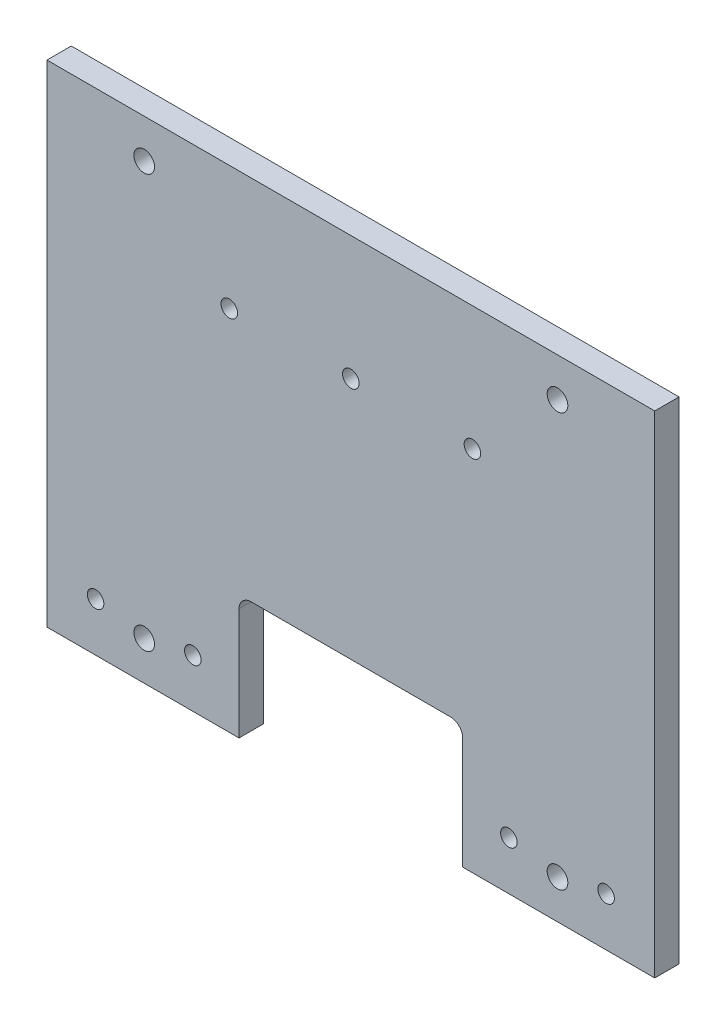
ISO-10303-21;
HEADER;
FILE_DESCRIPTION(('STEP AP214'),'2;1');
FILE_NAME('part.step','',(''),(''),'','','');
FILE_SCHEMA(('AUTOMOTIVE_DESIGN { 1 0 10303 214 1 1 1 1 }'));
ENDSEC;
DATA;
#1=APPLICATION_CONTEXT('core data for automotive mechanical design processes');
#2=APPLICATION_PROTOCOL_DEFINITION('international standard','automotive_design',2000,#1);
#3=PRODUCT_CONTEXT('',#1,'mechanical');
#4=PRODUCT('Part','Part','',(#3));
#5=PRODUCT_RELATED_PRODUCT_CATEGORY('part','',(#4));
#6=PRODUCT_DEFINITION_FORMATION('','',#4);
#7=PRODUCT_DEFINITION_CONTEXT('part definition',#1,'design');
#8=PRODUCT_DEFINITION('design','',#6,#7);
#9=PRODUCT_DEFINITION_SHAPE('','',#8);
#10=(LENGTH_UNIT() NAMED_UNIT(*) SI_UNIT(.MILLI.,.METRE.));
#11=(NAMED_UNIT(*) PLANE_ANGLE_UNIT() SI_UNIT($,.RADIAN.));
#12=(NAMED_UNIT(*) SI_UNIT($,.STERADIAN.) SOLID_ANGLE_UNIT());
#13=UNCERTAINTY_MEASURE_WITH_UNIT(LENGTH_MEASURE(1.E-05),#10,'distance_accuracy_value','');
#14=(GEOMETRIC_REPRESENTATION_CONTEXT(3) GLOBAL_UNCERTAINTY_ASSIGNED_CONTEXT((#13)) GLOBAL_UNIT_ASSIGNED_CONTEXT((#10,
#11,#12)) REPRESENTATION_CONTEXT('',''));
#15=CARTESIAN_POINT('',(0.,0.,0.));
#16=DIRECTION('',(0.,0.,1.));
#17=DIRECTION('',(1.,0.,0.));
#18=AXIS2_PLACEMENT_3D('',#15,#16,#17);
#19=CARTESIAN_POINT('',(-41.,-55.,10.));
#20=DIRECTION('',(0.,0.,-1.));
#21=DIRECTION('',(-1.,0.,0.));
#22=AXIS2_PLACEMENT_3D('',#19,#20,#21);
#23=CYLINDRICAL_SURFACE('',#22,5.);
#24=CARTESIAN_POINT('',(-41.,-55.,0.));
#25=DIRECTION('',(0.,0.,1.));
#26=DIRECTION('',(1.,0.,0.));
#27=AXIS2_PLACEMENT_3D('',#24,#25,#26);
#28=CIRCLE('',#27,5.);
#29=CARTESIAN_POINT('',(-41.,-50.,0.));
#30=VERTEX_POINT('',#29);
#31=CARTESIAN_POINT('',(-46.,-55.,0.));
#32=VERTEX_POINT('',#31);
#33=EDGE_CURVE('E165',#30,#32,#28,.T.);
#34=ORIENTED_EDGE('',*,*,#33,.F.);
#35=DIRECTION('',(0.,0.,-1.));
#36=VECTOR('',#35,1.);
#37=CARTESIAN_POINT('',(-41.,-50.,10.));
#38=LINE('',#37,#36);
#39=CARTESIAN_POINT('',(-41.,-50.,10.));
#40=VERTEX_POINT('',#39);
#41=EDGE_CURVE('E11',#40,#30,#38,.T.);
#42=ORIENTED_EDGE('',*,*,#41,.F.);
#43=CARTESIAN_POINT('',(-41.,-55.,10.));
#44=DIRECTION('',(0.,0.,1.));
#45=DIRECTION('',(1.,0.,0.));
#46=AXIS2_PLACEMENT_3D('',#43,#44,#45);
#47=CIRCLE('',#46,5.);
#48=CARTESIAN_POINT('',(-46.,-55.,10.));
#49=VERTEX_POINT('',#48);
#50=EDGE_CURVE('E159',#40,#49,#47,.T.);
#51=ORIENTED_EDGE('',*,*,#50,.T.);
#52=DIRECTION('',(0.,0.,-1.));
#53=VECTOR('',#52,1.);
#54=CARTESIAN_POINT('',(-46.,-55.,10.));
#55=LINE('',#54,#53);
#56=EDGE_CURVE('E54',#49,#32,#55,.T.);
#57=ORIENTED_EDGE('',*,*,#56,.T.);
#58=EDGE_LOOP('',(#34,#42,#51,#57));
#59=FACE_BOUND('',#58,.T.);
#60=ADVANCED_FACE('F38',(#59),#23,.F.);
#61=CARTESIAN_POINT('',(0.,-50.,10.));
#62=DIRECTION('',(0.,-1.,0.));
#63=DIRECTION('',(1.,0.,0.));
#64=AXIS2_PLACEMENT_3D('',#61,#62,#63);
#65=PLANE('',#64);
#66=DIRECTION('',(-1.,0.,0.));
#67=VECTOR('',#66,1.);
#68=CARTESIAN_POINT('',(0.,-50.,0.));
#69=LINE('',#68,#67);
#70=CARTESIAN_POINT('',(40.9999999999999,-50.,0.));
#71=VERTEX_POINT('',#70);
#72=EDGE_CURVE('E261',#71,#30,#69,.T.);
#73=ORIENTED_EDGE('',*,*,#72,.F.);
#74=DIRECTION('',(0.,0.,-1.));
#75=VECTOR('',#74,1.);
#76=CARTESIAN_POINT('',(40.9999999999999,-50.,10.));
#77=LINE('',#76,#75);
#78=CARTESIAN_POINT('',(40.9999999999999,-50.,10.));
#79=VERTEX_POINT('',#78);
#80=EDGE_CURVE('E46',#79,#71,#77,.T.);
#81=ORIENTED_EDGE('',*,*,#80,.F.);
#82=DIRECTION('',(-1.,0.,0.));
#83=VECTOR('',#82,1.);
#84=CARTESIAN_POINT('',(0.,-50.,10.));
#85=LINE('',#84,#83);
#86=EDGE_CURVE('E154',#79,#40,#85,.T.);
#87=ORIENTED_EDGE('',*,*,#86,.T.);
#88=ORIENTED_EDGE('',*,*,#41,.T.);
#89=EDGE_LOOP('',(#73,#81,#87,#88));
#90=FACE_BOUND('',#89,.T.);
#91=ADVANCED_FACE('F294',(#90),#65,.T.);
#92=CARTESIAN_POINT('',(41.,-55.,10.));
#93=DIRECTION('',(0.,0.,-1.));
#94=DIRECTION('',(-1.,0.,0.));
#95=AXIS2_PLACEMENT_3D('',#92,#93,#94);
#96=CYLINDRICAL_SURFACE('',#95,5.);
#97=CARTESIAN_POINT('',(41.,-55.,0.));
#98=DIRECTION('',(0.,0.,1.));
#99=DIRECTION('',(1.,0.,0.));
#100=AXIS2_PLACEMENT_3D('',#97,#98,#99);
#101=CIRCLE('',#100,5.);
#102=CARTESIAN_POINT('',(46.,-55.,0.));
#103=VERTEX_POINT('',#102);
#104=EDGE_CURVE('E286',#71,#103,#101,.F.);
#105=ORIENTED_EDGE('',*,*,#104,.T.);
#106=DIRECTION('',(0.,0.,-1.));
#107=VECTOR('',#106,1.);
#108=CARTESIAN_POINT('',(46.,-55.,10.));
#109=LINE('',#108,#107);
#110=CARTESIAN_POINT('',(46.,-55.,10.));
#111=VERTEX_POINT('',#110);
#112=EDGE_CURVE('E280',#111,#103,#109,.T.);
#113=ORIENTED_EDGE('',*,*,#112,.F.);
#114=CARTESIAN_POINT('',(41.,-55.,10.));
#115=DIRECTION('',(0.,0.,1.));
#116=DIRECTION('',(1.,0.,0.));
#117=AXIS2_PLACEMENT_3D('',#114,#115,#116);
#118=CIRCLE('',#117,5.);
#119=EDGE_CURVE('E151',#79,#111,#118,.F.);
#120=ORIENTED_EDGE('',*,*,#119,.F.);
#121=ORIENTED_EDGE('',*,*,#80,.T.);
#122=EDGE_LOOP('',(#105,#113,#120,#121));
#123=FACE_BOUND('',#122,.T.);
#124=ADVANCED_FACE('F284',(#123),#96,.F.);
#125=CARTESIAN_POINT('',(46.,0.,10.));
#126=DIRECTION('',(1.,0.,0.));
#127=DIRECTION('',(0.,0.,-1.));
#128=AXIS2_PLACEMENT_3D('',#125,#126,#127);
#129=PLANE('',#128);
#130=DIRECTION('',(0.,-1.,0.));
#131=VECTOR('',#130,1.);
#132=CARTESIAN_POINT('',(46.,0.,0.));
#133=LINE('',#132,#131);
#134=CARTESIAN_POINT('',(46.,-101.,0.));
#135=VERTEX_POINT('',#134);
#136=EDGE_CURVE('E292',#103,#135,#133,.T.);
#137=ORIENTED_EDGE('',*,*,#136,.T.);
#138=DIRECTION('',(0.,0.,-1.));
#139=VECTOR('',#138,1.);
#140=CARTESIAN_POINT('',(46.,-101.,10.));
#141=LINE('',#140,#139);
#142=CARTESIAN_POINT('',(46.,-101.,10.));
#143=VERTEX_POINT('',#142);
#144=EDGE_CURVE('E278',#143,#135,#141,.T.);
#145=ORIENTED_EDGE('',*,*,#144,.F.);
#146=DIRECTION('',(0.,-1.,0.));
#147=VECTOR('',#146,1.);
#148=CARTESIAN_POINT('',(46.,0.,10.));
#149=LINE('',#148,#147);
#150=EDGE_CURVE('E147',#111,#143,#149,.T.);
#151=ORIENTED_EDGE('',*,*,#150,.F.);
#152=ORIENTED_EDGE('',*,*,#112,.T.);
#153=EDGE_LOOP('',(#137,#145,#151,#152));
#154=FACE_BOUND('',#153,.T.);
#155=ADVANCED_FACE('F310',(#154),#129,.F.);
#156=CARTESIAN_POINT('',(0.,-101.,10.));
#157=DIRECTION('',(0.,-1.,0.));
#158=DIRECTION('',(1.,0.,0.));
#159=AXIS2_PLACEMENT_3D('',#156,#157,#158);
#160=PLANE('',#159);
#161=DIRECTION('',(-1.,0.,0.));
#162=VECTOR('',#161,1.);
#163=CARTESIAN_POINT('',(0.,-101.,0.));
#164=LINE('',#163,#162);
#165=CARTESIAN_POINT('',(125.,-101.,0.));
#166=VERTEX_POINT('',#165);
#167=EDGE_CURVE('E267',#166,#135,#164,.T.);
#168=ORIENTED_EDGE('',*,*,#167,.F.);
#169=DIRECTION('',(0.,0.,-1.));
#170=VECTOR('',#169,1.);
#171=CARTESIAN_POINT('',(125.,-101.,10.));
#172=LINE('',#171,#170);
#173=CARTESIAN_POINT('',(125.,-101.,10.));
#174=VERTEX_POINT('',#173);
#175=EDGE_CURVE('E276',#174,#166,#172,.T.);
#176=ORIENTED_EDGE('',*,*,#175,.F.);
#177=DIRECTION('',(-1.,0.,0.));
#178=VECTOR('',#177,1.);
#179=CARTESIAN_POINT('',(0.,-101.,10.));
#180=LINE('',#179,#178);
#181=EDGE_CURVE('E141',#174,#143,#180,.T.);
#182=ORIENTED_EDGE('',*,*,#181,.T.);
#183=ORIENTED_EDGE('',*,*,#144,.T.);
#184=EDGE_LOOP('',(#168,#176,#182,#183));
#185=FACE_BOUND('',#184,.T.);
#186=ADVANCED_FACE('F308',(#185),#160,.T.);
#187=CARTESIAN_POINT('',(125.,0.,10.));
#188=DIRECTION('',(1.,0.,0.));
#189=DIRECTION('',(0.,1.,0.));
#190=AXIS2_PLACEMENT_3D('',#187,#188,#189);
#191=PLANE('',#190);
#192=DIRECTION('',(0.,-1.,0.));
#193=VECTOR('',#192,1.);
#194=CARTESIAN_POINT('',(125.,0.,0.));
#195=LINE('',#194,#193);
#196=CARTESIAN_POINT('',(125.,101.,0.));
#197=VERTEX_POINT('',#196);
#198=EDGE_CURVE('E298',#197,#166,#195,.T.);
#199=ORIENTED_EDGE('',*,*,#198,.F.);
#200=DIRECTION('',(0.,0.,-1.));
#201=VECTOR('',#200,1.);
#202=CARTESIAN_POINT('',(125.,101.,10.));
#203=LINE('',#202,#201);
#204=CARTESIAN_POINT('',(125.,101.,10.));
#205=VERTEX_POINT('',#204);
#206=EDGE_CURVE('E274',#205,#197,#203,.T.);
#207=ORIENTED_EDGE('',*,*,#206,.F.);
#208=DIRECTION('',(0.,-1.,0.));
#209=VECTOR('',#208,1.);
#210=CARTESIAN_POINT('',(125.,0.,10.));
#211=LINE('',#210,#209);
#212=EDGE_CURVE('E146',#205,#174,#211,.T.);
#213=ORIENTED_EDGE('',*,*,#212,.T.);
#214=ORIENTED_EDGE('',*,*,#175,.T.);
#215=EDGE_LOOP('',(#199,#207,#213,#214));
#216=FACE_BOUND('',#215,.T.);
#217=ADVANCED_FACE('F306',(#216),#191,.T.);
#218=CARTESIAN_POINT('',(0.,101.,10.));
#219=DIRECTION('',(0.,-1.,0.));
#220=DIRECTION('',(1.,0.,0.));
#221=AXIS2_PLACEMENT_3D('',#218,#219,#220);
#222=PLANE('',#221);
#223=DIRECTION('',(-1.,0.,0.));
#224=VECTOR('',#223,1.);
#225=CARTESIAN_POINT('',(0.,101.,0.));
#226=LINE('',#225,#224);
#227=CARTESIAN_POINT('',(-125.,101.,0.));
#228=VERTEX_POINT('',#227);
#229=EDGE_CURVE('E300',#197,#228,#226,.T.);
#230=ORIENTED_EDGE('',*,*,#229,.T.);
#231=DIRECTION('',(0.,0.,-1.));
#232=VECTOR('',#231,1.);
#233=CARTESIAN_POINT('',(-125.,101.,10.));
#234=LINE('',#233,#232);
#235=CARTESIAN_POINT('',(-125.,101.,10.));
#236=VERTEX_POINT('',#235);
#237=EDGE_CURVE('E136',#236,#228,#234,.T.);
#238=ORIENTED_EDGE('',*,*,#237,.F.);
#239=DIRECTION('',(-1.,0.,0.));
#240=VECTOR('',#239,1.);
#241=CARTESIAN_POINT('',(0.,101.,10.));
#242=LINE('',#241,#240);
#243=EDGE_CURVE('E124',#205,#236,#242,.T.);
#244=ORIENTED_EDGE('',*,*,#243,.F.);
#245=ORIENTED_EDGE('',*,*,#206,.T.);
#246=EDGE_LOOP('',(#230,#238,#244,#245));
#247=FACE_BOUND('',#246,.T.);
#248=ADVANCED_FACE('F303',(#247),#222,.F.);
#249=CARTESIAN_POINT('',(-125.,0.,10.));
#250=DIRECTION('',(1.,0.,0.));
#251=DIRECTION('',(0.,1.,0.));
#252=AXIS2_PLACEMENT_3D('',#249,#250,#251);
#253=PLANE('',#252);
#254=DIRECTION('',(0.,-1.,0.));
#255=VECTOR('',#254,1.);
#256=CARTESIAN_POINT('',(-125.,0.,0.));
#257=LINE('',#256,#255);
#258=CARTESIAN_POINT('',(-125.,-101.,0.));
#259=VERTEX_POINT('',#258);
#260=EDGE_CURVE('E133',#228,#259,#257,.T.);
#261=ORIENTED_EDGE('',*,*,#260,.T.);
#262=DIRECTION('',(0.,0.,-1.));
#263=VECTOR('',#262,1.);
#264=CARTESIAN_POINT('',(-125.,-101.,10.));
#265=LINE('',#264,#263);
#266=CARTESIAN_POINT('',(-125.,-101.,10.));
#267=VERTEX_POINT('',#266);
#268=EDGE_CURVE('E130',#267,#259,#265,.T.);
#269=ORIENTED_EDGE('',*,*,#268,.F.);
#270=DIRECTION('',(0.,-1.,0.));
#271=VECTOR('',#270,1.);
#272=CARTESIAN_POINT('',(-125.,0.,10.));
#273=LINE('',#272,#271);
#274=EDGE_CURVE('E116',#236,#267,#273,.T.);
#275=ORIENTED_EDGE('',*,*,#274,.F.);
#276=ORIENTED_EDGE('',*,*,#237,.T.);
#277=EDGE_LOOP('',(#261,#269,#275,#276));
#278=FACE_BOUND('',#277,.T.);
#279=ADVANCED_FACE('F131',(#278),#253,.F.);
#280=CARTESIAN_POINT('',(-46.,-101.,0.));
#281=VERTEX_POINT('',#280);
#282=EDGE_CURVE('E264',#281,#259,#164,.T.);
#283=ORIENTED_EDGE('',*,*,#282,.F.);
#284=DIRECTION('',(0.,0.,-1.));
#285=VECTOR('',#284,1.);
#286=CARTESIAN_POINT('',(-46.,-101.,10.));
#287=LINE('',#286,#285);
#288=CARTESIAN_POINT('',(-46.,-101.,10.));
#289=VERTEX_POINT('',#288);
#290=EDGE_CURVE('E85',#289,#281,#287,.T.);
#291=ORIENTED_EDGE('',*,*,#290,.F.);
#292=EDGE_CURVE('E121',#289,#267,#180,.T.);
#293=ORIENTED_EDGE('',*,*,#292,.T.);
#294=ORIENTED_EDGE('',*,*,#268,.T.);
#295=EDGE_LOOP('',(#283,#291,#293,#294));
#296=FACE_BOUND('',#295,.T.);
#297=ADVANCED_FACE('F138',(#296),#160,.T.);
#298=CARTESIAN_POINT('',(-46.,0.,10.));
#299=DIRECTION('',(1.,0.,0.));
#300=DIRECTION('',(0.,0.,-1.));
#301=AXIS2_PLACEMENT_3D('',#298,#299,#300);
#302=PLANE('',#301);
#303=DIRECTION('',(0.,-1.,0.));
#304=VECTOR('',#303,1.);
#305=CARTESIAN_POINT('',(-46.,0.,0.));
#306=LINE('',#305,#304);
#307=EDGE_CURVE('E161',#32,#281,#306,.T.);
#308=ORIENTED_EDGE('',*,*,#307,.F.);
#309=ORIENTED_EDGE('',*,*,#56,.F.);
#310=DIRECTION('',(0.,-1.,0.));
#311=VECTOR('',#310,1.);
#312=CARTESIAN_POINT('',(-46.,0.,10.));
#313=LINE('',#312,#311);
#314=EDGE_CURVE('E139',#49,#289,#313,.T.);
#315=ORIENTED_EDGE('',*,*,#314,.T.);
#316=ORIENTED_EDGE('',*,*,#290,.T.);
#317=EDGE_LOOP('',(#308,#309,#315,#316));
#318=FACE_BOUND('',#317,.T.);
#319=ADVANCED_FACE('F263',(#318),#302,.T.);
#320=CARTESIAN_POINT('',(0.,0.,10.));
#321=DIRECTION('',(0.,0.,1.));
#322=DIRECTION('',(1.,0.,0.));
#323=AXIS2_PLACEMENT_3D('',#320,#321,#322);
#324=PLANE('',#323);
#325=CARTESIAN_POINT('',(50.,50.,10.));
#326=DIRECTION('',(0.,0.,-1.));
#327=DIRECTION('',(-1.,0.,0.));
#328=AXIS2_PLACEMENT_3D('',#325,#326,#327);
#329=CIRCLE('',#328,3.4);
#330=CARTESIAN_POINT('',(46.6,50.,10.));
#331=VERTEX_POINT('',#330);
#332=EDGE_CURVE('E223',#331,#331,#329,.T.);
#333=ORIENTED_EDGE('',*,*,#332,.T.);
#334=EDGE_LOOP('',(#333));
#335=FACE_BOUND('',#334,.T.);
#336=CARTESIAN_POINT('',(0.,50.,10.));
#337=DIRECTION('',(0.,0.,-1.));
#338=DIRECTION('',(-1.,0.,0.));
#339=AXIS2_PLACEMENT_3D('',#336,#337,#338);
#340=CIRCLE('',#339,3.4);
#341=CARTESIAN_POINT('',(-3.4,50.,10.));
#342=VERTEX_POINT('',#341);
#343=EDGE_CURVE('E217',#342,#342,#340,.T.);
#344=ORIENTED_EDGE('',*,*,#343,.T.);
#345=EDGE_LOOP('',(#344));
#346=FACE_BOUND('',#345,.T.);
#347=CARTESIAN_POINT('',(-50.,50.,10.));
#348=DIRECTION('',(0.,0.,-1.));
#349=DIRECTION('',(-1.,0.,0.));
#350=AXIS2_PLACEMENT_3D('',#347,#348,#349);
#351=CIRCLE('',#350,3.4);
#352=CARTESIAN_POINT('',(-53.4,50.,10.));
#353=VERTEX_POINT('',#352);
#354=EDGE_CURVE('E211',#353,#353,#351,.T.);
#355=ORIENTED_EDGE('',*,*,#354,.T.);
#356=EDGE_LOOP('',(#355));
#357=FACE_BOUND('',#356,.T.);
#358=CARTESIAN_POINT('',(105.,-81.,10.));
#359=DIRECTION('',(0.,0.,-1.));
#360=DIRECTION('',(-1.,0.,0.));
#361=AXIS2_PLACEMENT_3D('',#358,#359,#360);
#362=CIRCLE('',#361,3.4);
#363=CARTESIAN_POINT('',(101.6,-81.,10.));
#364=VERTEX_POINT('',#363);
#365=EDGE_CURVE('E205',#364,#364,#362,.T.);
#366=ORIENTED_EDGE('',*,*,#365,.T.);
#367=EDGE_LOOP('',(#366));
#368=FACE_BOUND('',#367,.T.);
#369=CARTESIAN_POINT('',(65.,-81.,10.));
#370=DIRECTION('',(0.,0.,-1.));
#371=DIRECTION('',(-1.,0.,0.));
#372=AXIS2_PLACEMENT_3D('',#369,#370,#371);
#373=CIRCLE('',#372,3.4);
#374=CARTESIAN_POINT('',(61.6,-81.,10.));
#375=VERTEX_POINT('',#374);
#376=EDGE_CURVE('E199',#375,#375,#373,.T.);
#377=ORIENTED_EDGE('',*,*,#376,.T.);
#378=EDGE_LOOP('',(#377));
#379=FACE_BOUND('',#378,.T.);
#380=CARTESIAN_POINT('',(-65.,-81.,10.));
#381=DIRECTION('',(0.,0.,-1.));
#382=DIRECTION('',(-1.,0.,0.));
#383=AXIS2_PLACEMENT_3D('',#380,#381,#382);
#384=CIRCLE('',#383,3.4);
#385=CARTESIAN_POINT('',(-68.4,-81.,10.));
#386=VERTEX_POINT('',#385);
#387=EDGE_CURVE('E193',#386,#386,#384,.T.);
#388=ORIENTED_EDGE('',*,*,#387,.T.);
#389=EDGE_LOOP('',(#388));
#390=FACE_BOUND('',#389,.T.);
#391=CARTESIAN_POINT('',(-105.,-81.,10.));
#392=DIRECTION('',(0.,0.,-1.));
#393=DIRECTION('',(-1.,0.,0.));
#394=AXIS2_PLACEMENT_3D('',#391,#392,#393);
#395=CIRCLE('',#394,3.4);
#396=CARTESIAN_POINT('',(-108.4,-81.,10.));
#397=VERTEX_POINT('',#396);
#398=EDGE_CURVE('E187',#397,#397,#395,.T.);
#399=ORIENTED_EDGE('',*,*,#398,.T.);
#400=EDGE_LOOP('',(#399));
#401=FACE_BOUND('',#400,.T.);
#402=CARTESIAN_POINT('',(85.,-85.,10.));
#403=DIRECTION('',(0.,0.,1.));
#404=DIRECTION('',(1.,0.,0.));
#405=AXIS2_PLACEMENT_3D('',#402,#403,#404);
#406=CIRCLE('',#405,4.24999999999999);
#407=CARTESIAN_POINT('',(89.25,-85.,10.));
#408=VERTEX_POINT('',#407);
#409=EDGE_CURVE('E184',#408,#408,#406,.T.);
#410=ORIENTED_EDGE('',*,*,#409,.F.);
#411=EDGE_LOOP('',(#410));
#412=FACE_BOUND('',#411,.T.);
#413=CARTESIAN_POINT('',(-85.,-85.,10.));
#414=DIRECTION('',(0.,0.,1.));
#415=DIRECTION('',(1.,0.,0.));
#416=AXIS2_PLACEMENT_3D('',#413,#414,#415);
#417=CIRCLE('',#416,4.24999999999999);
#418=CARTESIAN_POINT('',(-80.75,-85.,10.));
#419=VERTEX_POINT('',#418);
#420=EDGE_CURVE('E178',#419,#419,#417,.T.);
#421=ORIENTED_EDGE('',*,*,#420,.F.);
#422=EDGE_LOOP('',(#421));
#423=FACE_BOUND('',#422,.T.);
#424=CARTESIAN_POINT('',(-85.,85.,10.));
#425=DIRECTION('',(0.,0.,1.));
#426=DIRECTION('',(1.,0.,0.));
#427=AXIS2_PLACEMENT_3D('',#424,#425,#426);
#428=CIRCLE('',#427,4.24999999999999);
#429=CARTESIAN_POINT('',(-80.75,85.,10.));
#430=VERTEX_POINT('',#429);
#431=EDGE_CURVE('E172',#430,#430,#428,.T.);
#432=ORIENTED_EDGE('',*,*,#431,.F.);
#433=EDGE_LOOP('',(#432));
#434=FACE_BOUND('',#433,.T.);
#435=CARTESIAN_POINT('',(85.,85.,10.));
#436=DIRECTION('',(0.,0.,1.));
#437=DIRECTION('',(1.,0.,0.));
#438=AXIS2_PLACEMENT_3D('',#435,#436,#437);
#439=CIRCLE('',#438,4.24999999999999);
#440=CARTESIAN_POINT('',(89.25,85.,10.));
#441=VERTEX_POINT('',#440);
#442=EDGE_CURVE('E166',#441,#441,#439,.T.);
#443=ORIENTED_EDGE('',*,*,#442,.F.);
#444=EDGE_LOOP('',(#443));
#445=FACE_BOUND('',#444,.T.);
#446=ORIENTED_EDGE('',*,*,#50,.F.);
#447=ORIENTED_EDGE('',*,*,#86,.F.);
#448=ORIENTED_EDGE('',*,*,#119,.T.);
#449=ORIENTED_EDGE('',*,*,#150,.T.);
#450=ORIENTED_EDGE('',*,*,#181,.F.);
#451=ORIENTED_EDGE('',*,*,#212,.F.);
#452=ORIENTED_EDGE('',*,*,#243,.T.);
#453=ORIENTED_EDGE('',*,*,#274,.T.);
#454=ORIENTED_EDGE('',*,*,#292,.F.);
#455=ORIENTED_EDGE('',*,*,#314,.F.);
#456=EDGE_LOOP('',(#446,#447,#448,#449,#450,#451,#452,#453,#454,#455));
#457=FACE_BOUND('',#456,.T.);
#458=ADVANCED_FACE('F118',(#335,#346,#357,#368,#379,#390,#401,#412,#423,#434,#445,#457),#324,.T.);
#459=CARTESIAN_POINT('',(0.,0.,0.));
#460=DIRECTION('',(0.,0.,1.));
#461=DIRECTION('',(1.,0.,0.));
#462=AXIS2_PLACEMENT_3D('',#459,#460,#461);
#463=PLANE('',#462);
#464=CARTESIAN_POINT('',(50.,50.,0.));
#465=DIRECTION('',(0.,0.,-1.));
#466=DIRECTION('',(-1.,0.,0.));
#467=AXIS2_PLACEMENT_3D('',#464,#465,#466);
#468=CIRCLE('',#467,3.4);
#469=CARTESIAN_POINT('',(46.6,50.,0.));
#470=VERTEX_POINT('',#469);
#471=EDGE_CURVE('E226',#470,#470,#468,.T.);
#472=ORIENTED_EDGE('',*,*,#471,.F.);
#473=EDGE_LOOP('',(#472));
#474=FACE_BOUND('',#473,.T.);
#475=CARTESIAN_POINT('',(0.,50.,0.));
#476=DIRECTION('',(0.,0.,-1.));
#477=DIRECTION('',(-1.,0.,0.));
#478=AXIS2_PLACEMENT_3D('',#475,#476,#477);
#479=CIRCLE('',#478,3.4);
#480=CARTESIAN_POINT('',(-3.40000000000001,50.,0.));
#481=VERTEX_POINT('',#480);
#482=EDGE_CURVE('E220',#481,#481,#479,.T.);
#483=ORIENTED_EDGE('',*,*,#482,.F.);
#484=EDGE_LOOP('',(#483));
#485=FACE_BOUND('',#484,.T.);
#486=CARTESIAN_POINT('',(-50.,50.,0.));
#487=DIRECTION('',(0.,0.,-1.));
#488=DIRECTION('',(-1.,0.,0.));
#489=AXIS2_PLACEMENT_3D('',#486,#487,#488);
#490=CIRCLE('',#489,3.4);
#491=CARTESIAN_POINT('',(-53.4,50.,0.));
#492=VERTEX_POINT('',#491);
#493=EDGE_CURVE('E214',#492,#492,#490,.T.);
#494=ORIENTED_EDGE('',*,*,#493,.F.);
#495=EDGE_LOOP('',(#494));
#496=FACE_BOUND('',#495,.T.);
#497=CARTESIAN_POINT('',(105.,-81.,0.));
#498=DIRECTION('',(0.,0.,-1.));
#499=DIRECTION('',(-1.,0.,0.));
#500=AXIS2_PLACEMENT_3D('',#497,#498,#499);
#501=CIRCLE('',#500,3.4);
#502=CARTESIAN_POINT('',(101.6,-81.,0.));
#503=VERTEX_POINT('',#502);
#504=EDGE_CURVE('E208',#503,#503,#501,.T.);
#505=ORIENTED_EDGE('',*,*,#504,.F.);
#506=EDGE_LOOP('',(#505));
#507=FACE_BOUND('',#506,.T.);
#508=CARTESIAN_POINT('',(65.,-81.,0.));
#509=DIRECTION('',(0.,0.,-1.));
#510=DIRECTION('',(-1.,0.,0.));
#511=AXIS2_PLACEMENT_3D('',#508,#509,#510);
#512=CIRCLE('',#511,3.4);
#513=CARTESIAN_POINT('',(61.6,-81.,0.));
#514=VERTEX_POINT('',#513);
#515=EDGE_CURVE('E202',#514,#514,#512,.T.);
#516=ORIENTED_EDGE('',*,*,#515,.F.);
#517=EDGE_LOOP('',(#516));
#518=FACE_BOUND('',#517,.T.);
#519=CARTESIAN_POINT('',(-65.,-81.,0.));
#520=DIRECTION('',(0.,0.,-1.));
#521=DIRECTION('',(-1.,0.,0.));
#522=AXIS2_PLACEMENT_3D('',#519,#520,#521);
#523=CIRCLE('',#522,3.4);
#524=CARTESIAN_POINT('',(-68.4,-81.,0.));
#525=VERTEX_POINT('',#524);
#526=EDGE_CURVE('E196',#525,#525,#523,.T.);
#527=ORIENTED_EDGE('',*,*,#526,.F.);
#528=EDGE_LOOP('',(#527));
#529=FACE_BOUND('',#528,.T.);
#530=CARTESIAN_POINT('',(-105.,-81.,0.));
#531=DIRECTION('',(0.,0.,-1.));
#532=DIRECTION('',(-1.,0.,0.));
#533=AXIS2_PLACEMENT_3D('',#530,#531,#532);
#534=CIRCLE('',#533,3.4);
#535=CARTESIAN_POINT('',(-108.4,-81.,0.));
#536=VERTEX_POINT('',#535);
#537=EDGE_CURVE('E190',#536,#536,#534,.T.);
#538=ORIENTED_EDGE('',*,*,#537,.F.);
#539=EDGE_LOOP('',(#538));
#540=FACE_BOUND('',#539,.T.);
#541=CARTESIAN_POINT('',(85.,-85.,0.));
#542=DIRECTION('',(0.,0.,1.));
#543=DIRECTION('',(1.,0.,0.));
#544=AXIS2_PLACEMENT_3D('',#541,#542,#543);
#545=CIRCLE('',#544,4.25);
#546=CARTESIAN_POINT('',(89.25,-85.,0.));
#547=VERTEX_POINT('',#546);
#548=EDGE_CURVE('E181',#547,#547,#545,.T.);
#549=ORIENTED_EDGE('',*,*,#548,.T.);
#550=EDGE_LOOP('',(#549));
#551=FACE_BOUND('',#550,.T.);
#552=CARTESIAN_POINT('',(-85.,-85.,0.));
#553=DIRECTION('',(0.,0.,1.));
#554=DIRECTION('',(1.,0.,0.));
#555=AXIS2_PLACEMENT_3D('',#552,#553,#554);
#556=CIRCLE('',#555,4.25);
#557=CARTESIAN_POINT('',(-80.75,-85.,0.));
#558=VERTEX_POINT('',#557);
#559=EDGE_CURVE('E175',#558,#558,#556,.T.);
#560=ORIENTED_EDGE('',*,*,#559,.T.);
#561=EDGE_LOOP('',(#560));
#562=FACE_BOUND('',#561,.T.);
#563=CARTESIAN_POINT('',(-85.,85.,0.));
#564=DIRECTION('',(0.,0.,1.));
#565=DIRECTION('',(1.,0.,0.));
#566=AXIS2_PLACEMENT_3D('',#563,#564,#565);
#567=CIRCLE('',#566,4.25);
#568=CARTESIAN_POINT('',(-80.75,85.,0.));
#569=VERTEX_POINT('',#568);
#570=EDGE_CURVE('E169',#569,#569,#567,.T.);
#571=ORIENTED_EDGE('',*,*,#570,.T.);
#572=EDGE_LOOP('',(#571));
#573=FACE_BOUND('',#572,.T.);
#574=CARTESIAN_POINT('',(85.,85.,0.));
#575=DIRECTION('',(0.,0.,1.));
#576=DIRECTION('',(1.,0.,0.));
#577=AXIS2_PLACEMENT_3D('',#574,#575,#576);
#578=CIRCLE('',#577,4.25);
#579=CARTESIAN_POINT('',(89.25,85.,0.));
#580=VERTEX_POINT('',#579);
#581=EDGE_CURVE('E162',#580,#580,#578,.T.);
#582=ORIENTED_EDGE('',*,*,#581,.T.);
#583=EDGE_LOOP('',(#582));
#584=FACE_BOUND('',#583,.T.);
#585=ORIENTED_EDGE('',*,*,#33,.T.);
#586=ORIENTED_EDGE('',*,*,#307,.T.);
#587=ORIENTED_EDGE('',*,*,#282,.T.);
#588=ORIENTED_EDGE('',*,*,#260,.F.);
#589=ORIENTED_EDGE('',*,*,#229,.F.);
#590=ORIENTED_EDGE('',*,*,#198,.T.);
#591=ORIENTED_EDGE('',*,*,#167,.T.);
#592=ORIENTED_EDGE('',*,*,#136,.F.);
#593=ORIENTED_EDGE('',*,*,#104,.F.);
#594=ORIENTED_EDGE('',*,*,#72,.T.);
#595=EDGE_LOOP('',(#585,#586,#587,#588,#589,#590,#591,#592,#593,#594));
#596=FACE_BOUND('',#595,.T.);
#597=ADVANCED_FACE('F232',(#474,#485,#496,#507,#518,#529,#540,#551,#562,#573,#584,#596),#463,.F.);
#598=CARTESIAN_POINT('',(85.,85.,10.));
#599=DIRECTION('',(0.,0.,1.));
#600=DIRECTION('',(1.,0.,0.));
#601=AXIS2_PLACEMENT_3D('',#598,#599,#600);
#602=CYLINDRICAL_SURFACE('',#601,4.25);
#603=ORIENTED_EDGE('',*,*,#581,.F.);
#604=EDGE_LOOP('',(#603));
#605=FACE_BOUND('',#604,.T.);
#606=ORIENTED_EDGE('',*,*,#442,.T.);
#607=EDGE_LOOP('',(#606));
#608=FACE_BOUND('',#607,.T.);
#609=ADVANCED_FACE('F235',(#605,#608),#602,.F.);
#610=CARTESIAN_POINT('',(-85.,85.,10.));
#611=DIRECTION('',(0.,0.,1.));
#612=DIRECTION('',(1.,0.,0.));
#613=AXIS2_PLACEMENT_3D('',#610,#611,#612);
#614=CYLINDRICAL_SURFACE('',#613,4.25);
#615=ORIENTED_EDGE('',*,*,#570,.F.);
#616=EDGE_LOOP('',(#615));
#617=FACE_BOUND('',#616,.T.);
#618=ORIENTED_EDGE('',*,*,#431,.T.);
#619=EDGE_LOOP('',(#618));
#620=FACE_BOUND('',#619,.T.);
#621=ADVANCED_FACE('F390',(#617,#620),#614,.F.);
#622=CARTESIAN_POINT('',(-85.,-85.,10.));
#623=DIRECTION('',(0.,0.,1.));
#624=DIRECTION('',(1.,0.,0.));
#625=AXIS2_PLACEMENT_3D('',#622,#623,#624);
#626=CYLINDRICAL_SURFACE('',#625,4.25);
#627=ORIENTED_EDGE('',*,*,#559,.F.);
#628=EDGE_LOOP('',(#627));
#629=FACE_BOUND('',#628,.T.);
#630=ORIENTED_EDGE('',*,*,#420,.T.);
#631=EDGE_LOOP('',(#630));
#632=FACE_BOUND('',#631,.T.);
#633=ADVANCED_FACE('F403',(#629,#632),#626,.F.);
#634=CARTESIAN_POINT('',(85.,-85.,10.));
#635=DIRECTION('',(0.,0.,1.));
#636=DIRECTION('',(1.,0.,0.));
#637=AXIS2_PLACEMENT_3D('',#634,#635,#636);
#638=CYLINDRICAL_SURFACE('',#637,4.25);
#639=ORIENTED_EDGE('',*,*,#548,.F.);
#640=EDGE_LOOP('',(#639));
#641=FACE_BOUND('',#640,.T.);
#642=ORIENTED_EDGE('',*,*,#409,.T.);
#643=EDGE_LOOP('',(#642));
#644=FACE_BOUND('',#643,.T.);
#645=ADVANCED_FACE('F414',(#641,#644),#638,.F.);
#646=CARTESIAN_POINT('',(-105.,-81.,0.));
#647=DIRECTION('',(0.,0.,-1.));
#648=DIRECTION('',(-1.,0.,0.));
#649=AXIS2_PLACEMENT_3D('',#646,#647,#648);
#650=CYLINDRICAL_SURFACE('',#649,3.4);
#651=ORIENTED_EDGE('',*,*,#398,.F.);
#652=EDGE_LOOP('',(#651));
#653=FACE_BOUND('',#652,.T.);
#654=ORIENTED_EDGE('',*,*,#537,.T.);
#655=EDGE_LOOP('',(#654));
#656=FACE_BOUND('',#655,.T.);
#657=ADVANCED_FACE('F425',(#653,#656),#650,.F.);
#658=CARTESIAN_POINT('',(-65.,-81.,0.));
#659=DIRECTION('',(0.,0.,-1.));
#660=DIRECTION('',(-1.,0.,0.));
#661=AXIS2_PLACEMENT_3D('',#658,#659,#660);
#662=CYLINDRICAL_SURFACE('',#661,3.4);
#663=ORIENTED_EDGE('',*,*,#387,.F.);
#664=EDGE_LOOP('',(#663));
#665=FACE_BOUND('',#664,.T.);
#666=ORIENTED_EDGE('',*,*,#526,.T.);
#667=EDGE_LOOP('',(#666));
#668=FACE_BOUND('',#667,.T.);
#669=ADVANCED_FACE('F448',(#665,#668),#662,.F.);
#670=CARTESIAN_POINT('',(65.,-81.,0.));
#671=DIRECTION('',(0.,0.,-1.));
#672=DIRECTION('',(-1.,0.,0.));
#673=AXIS2_PLACEMENT_3D('',#670,#671,#672);
#674=CYLINDRICAL_SURFACE('',#673,3.4);
#675=ORIENTED_EDGE('',*,*,#376,.F.);
#676=EDGE_LOOP('',(#675));
#677=FACE_BOUND('',#676,.T.);
#678=ORIENTED_EDGE('',*,*,#515,.T.);
#679=EDGE_LOOP('',(#678));
#680=FACE_BOUND('',#679,.T.);
#681=ADVANCED_FACE('F459',(#677,#680),#674,.F.);
#682=CARTESIAN_POINT('',(105.,-81.,0.));
#683=DIRECTION('',(0.,0.,-1.));
#684=DIRECTION('',(-1.,0.,0.));
#685=AXIS2_PLACEMENT_3D('',#682,#683,#684);
#686=CYLINDRICAL_SURFACE('',#685,3.4);
#687=ORIENTED_EDGE('',*,*,#365,.F.);
#688=EDGE_LOOP('',(#687));
#689=FACE_BOUND('',#688,.T.);
#690=ORIENTED_EDGE('',*,*,#504,.T.);
#691=EDGE_LOOP('',(#690));
#692=FACE_BOUND('',#691,.T.);
#693=ADVANCED_FACE('F470',(#689,#692),#686,.F.);
#694=CARTESIAN_POINT('',(-50.,50.,0.));
#695=DIRECTION('',(0.,0.,-1.));
#696=DIRECTION('',(-1.,0.,0.));
#697=AXIS2_PLACEMENT_3D('',#694,#695,#696);
#698=CYLINDRICAL_SURFACE('',#697,3.4);
#699=ORIENTED_EDGE('',*,*,#354,.F.);
#700=EDGE_LOOP('',(#699));
#701=FACE_BOUND('',#700,.T.);
#702=ORIENTED_EDGE('',*,*,#493,.T.);
#703=EDGE_LOOP('',(#702));
#704=FACE_BOUND('',#703,.T.);
#705=ADVANCED_FACE('F481',(#701,#704),#698,.F.);
#706=CARTESIAN_POINT('',(0.,50.,0.));
#707=DIRECTION('',(0.,0.,-1.));
#708=DIRECTION('',(-1.,0.,0.));
#709=AXIS2_PLACEMENT_3D('',#706,#707,#708);
#710=CYLINDRICAL_SURFACE('',#709,3.4);
#711=ORIENTED_EDGE('',*,*,#343,.F.);
#712=EDGE_LOOP('',(#711));
#713=FACE_BOUND('',#712,.T.);
#714=ORIENTED_EDGE('',*,*,#482,.T.);
#715=EDGE_LOOP('',(#714));
#716=FACE_BOUND('',#715,.T.);
#717=ADVANCED_FACE('F492',(#713,#716),#710,.F.);
#718=CARTESIAN_POINT('',(50.,50.,0.));
#719=DIRECTION('',(0.,0.,-1.));
#720=DIRECTION('',(-1.,0.,0.));
#721=AXIS2_PLACEMENT_3D('',#718,#719,#720);
#722=CYLINDRICAL_SURFACE('',#721,3.4);
#723=ORIENTED_EDGE('',*,*,#332,.F.);
#724=EDGE_LOOP('',(#723));
#725=FACE_BOUND('',#724,.T.);
#726=ORIENTED_EDGE('',*,*,#471,.T.);
#727=EDGE_LOOP('',(#726));
#728=FACE_BOUND('',#727,.T.);
#729=ADVANCED_FACE('F230',(#725,#728),#722,.F.);
#730=CLOSED_SHELL('',(#60,#91,#124,#155,#186,#217,#248,#279,#297,#319,#458,#597,#609,#621,#633,
#645,#657,#669,#681,#693,#705,#717,#729));
#731=MANIFOLD_SOLID_BREP('B2',#730);
#732=ADVANCED_BREP_SHAPE_REPRESENTATION('',(#18,#731),#14);
#733=SHAPE_DEFINITION_REPRESENTATION(#9,#732);
ENDSEC;
END-ISO-10303-21;
